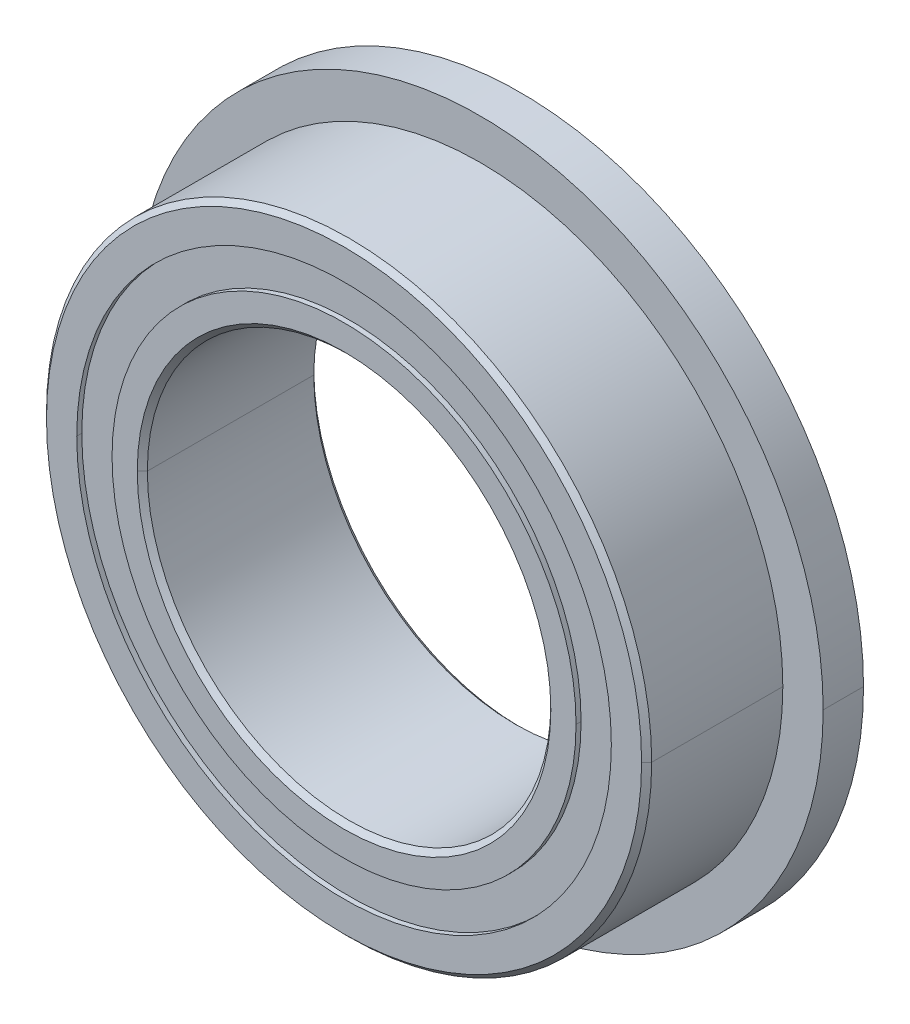
ISO-10303-21;
HEADER;
FILE_DESCRIPTION(('STEP AP214'),'2;1');
FILE_NAME('part.step','',(''),(''),'','','');
FILE_SCHEMA(('AUTOMOTIVE_DESIGN { 1 0 10303 214 1 1 1 1 }'));
ENDSEC;
DATA;
#1=APPLICATION_CONTEXT('core data for automotive mechanical design processes');
#2=APPLICATION_PROTOCOL_DEFINITION('international standard','automotive_design',2000,#1);
#3=PRODUCT_CONTEXT('',#1,'mechanical');
#4=PRODUCT('Part','Part','',(#3));
#5=PRODUCT_RELATED_PRODUCT_CATEGORY('part','',(#4));
#6=PRODUCT_DEFINITION_FORMATION('','',#4);
#7=PRODUCT_DEFINITION_CONTEXT('part definition',#1,'design');
#8=PRODUCT_DEFINITION('design','',#6,#7);
#9=PRODUCT_DEFINITION_SHAPE('','',#8);
#10=(LENGTH_UNIT() NAMED_UNIT(*) SI_UNIT(.MILLI.,.METRE.));
#11=(NAMED_UNIT(*) PLANE_ANGLE_UNIT() SI_UNIT($,.RADIAN.));
#12=(NAMED_UNIT(*) SI_UNIT($,.STERADIAN.) SOLID_ANGLE_UNIT());
#13=UNCERTAINTY_MEASURE_WITH_UNIT(LENGTH_MEASURE(1.E-05),#10,'distance_accuracy_value','');
#14=(GEOMETRIC_REPRESENTATION_CONTEXT(3) GLOBAL_UNCERTAINTY_ASSIGNED_CONTEXT((#13)) GLOBAL_UNIT_ASSIGNED_CONTEXT((#10,
#11,#12)) REPRESENTATION_CONTEXT('',''));
#15=CARTESIAN_POINT('',(0.,0.,0.));
#16=DIRECTION('',(0.,0.,1.));
#17=DIRECTION('',(1.,0.,0.));
#18=AXIS2_PLACEMENT_3D('',#15,#16,#17);
#19=CARTESIAN_POINT('',(0.,0.,1.65));
#20=DIRECTION('',(0.,0.,1.));
#21=DIRECTION('',(1.,0.,0.));
#22=AXIS2_PLACEMENT_3D('',#19,#20,#21);
#23=CONICAL_SURFACE('',#22,4.,0.785398163397435);
#24=DIRECTION('',(-0.707106781186538,0.,0.707106781186557));
#25=VECTOR('',#24,1.);
#26=CARTESIAN_POINT('',(-4.,0.,1.65));
#27=LINE('',#26,#25);
#28=CARTESIAN_POINT('',(-4.,0.,1.65));
#29=VERTEX_POINT('',#28);
#30=CARTESIAN_POINT('',(-4.1,0.,1.75));
#31=VERTEX_POINT('',#30);
#32=EDGE_CURVE('E358',#29,#31,#27,.T.);
#33=ORIENTED_EDGE('',*,*,#32,.F.);
#34=CARTESIAN_POINT('',(0.,0.,1.65));
#35=DIRECTION('',(0.,0.,1.));
#36=DIRECTION('',(-1.,0.,0.));
#37=AXIS2_PLACEMENT_3D('',#34,#35,#36);
#38=CIRCLE('',#37,4.);
#39=CARTESIAN_POINT('',(4.,0.,1.65));
#40=VERTEX_POINT('',#39);
#41=EDGE_CURVE('E308',#40,#29,#38,.T.);
#42=ORIENTED_EDGE('',*,*,#41,.F.);
#43=DIRECTION('',(0.707106781186538,0.,0.707106781186557));
#44=VECTOR('',#43,1.);
#45=CARTESIAN_POINT('',(4.,0.,1.65));
#46=LINE('',#45,#44);
#47=CARTESIAN_POINT('',(4.1,0.,1.75));
#48=VERTEX_POINT('',#47);
#49=EDGE_CURVE('E371',#40,#48,#46,.T.);
#50=ORIENTED_EDGE('',*,*,#49,.T.);
#51=CARTESIAN_POINT('',(0.,0.,1.75));
#52=DIRECTION('',(0.,0.,-1.));
#53=DIRECTION('',(-1.,0.,0.));
#54=AXIS2_PLACEMENT_3D('',#51,#52,#53);
#55=CIRCLE('',#54,4.1);
#56=EDGE_CURVE('E298',#31,#48,#55,.T.);
#57=ORIENTED_EDGE('',*,*,#56,.F.);
#58=EDGE_LOOP('',(#33,#42,#50,#57));
#59=FACE_BOUND('',#58,.T.);
#60=ADVANCED_FACE('F16',(#59),#23,.F.);
#61=CARTESIAN_POINT('',(0.,0.,-1.75));
#62=DIRECTION('',(0.,0.,-1.));
#63=DIRECTION('',(-1.,0.,0.));
#64=AXIS2_PLACEMENT_3D('',#61,#62,#63);
#65=CONICAL_SURFACE('',#64,4.1,0.785398163397448);
#66=DIRECTION('',(0.707106781186548,0.,-0.707106781186548));
#67=VECTOR('',#66,1.);
#68=CARTESIAN_POINT('',(4.1,0.,-1.75));
#69=LINE('',#68,#67);
#70=CARTESIAN_POINT('',(4.,0.,-1.65));
#71=VERTEX_POINT('',#70);
#72=CARTESIAN_POINT('',(4.1,0.,-1.75));
#73=VERTEX_POINT('',#72);
#74=EDGE_CURVE('E390',#71,#73,#69,.T.);
#75=ORIENTED_EDGE('',*,*,#74,.F.);
#76=CARTESIAN_POINT('',(0.,0.,-1.65));
#77=DIRECTION('',(0.,0.,-1.));
#78=DIRECTION('',(1.,0.,0.));
#79=AXIS2_PLACEMENT_3D('',#76,#77,#78);
#80=CIRCLE('',#79,4.);
#81=CARTESIAN_POINT('',(-4.,0.,-1.65));
#82=VERTEX_POINT('',#81);
#83=EDGE_CURVE('E305',#82,#71,#80,.T.);
#84=ORIENTED_EDGE('',*,*,#83,.F.);
#85=DIRECTION('',(-0.707106781186548,0.,-0.707106781186548));
#86=VECTOR('',#85,1.);
#87=CARTESIAN_POINT('',(-4.1,0.,-1.75));
#88=LINE('',#87,#86);
#89=CARTESIAN_POINT('',(-4.1,0.,-1.75));
#90=VERTEX_POINT('',#89);
#91=EDGE_CURVE('E404',#82,#90,#88,.T.);
#92=ORIENTED_EDGE('',*,*,#91,.T.);
#93=CARTESIAN_POINT('',(0.,0.,-1.75));
#94=DIRECTION('',(0.,0.,1.));
#95=DIRECTION('',(1.,0.,0.));
#96=AXIS2_PLACEMENT_3D('',#93,#94,#95);
#97=CIRCLE('',#96,4.1);
#98=EDGE_CURVE('E183',#73,#90,#97,.T.);
#99=ORIENTED_EDGE('',*,*,#98,.F.);
#100=EDGE_LOOP('',(#75,#84,#92,#99));
#101=FACE_BOUND('',#100,.T.);
#102=ADVANCED_FACE('F349',(#101),#65,.F.);
#103=CARTESIAN_POINT('',(0.,0.,1.75));
#104=DIRECTION('',(0.,0.,-1.));
#105=DIRECTION('',(-1.,0.,0.));
#106=AXIS2_PLACEMENT_3D('',#103,#104,#105);
#107=CONICAL_SURFACE('',#106,5.9,0.785398163397443);
#108=DIRECTION('',(0.707106781186545,0.,-0.707106781186551));
#109=VECTOR('',#108,1.);
#110=CARTESIAN_POINT('',(5.9,0.,1.75));
#111=LINE('',#110,#109);
#112=CARTESIAN_POINT('',(5.9,0.,1.75));
#113=VERTEX_POINT('',#112);
#114=CARTESIAN_POINT('',(6.,0.,1.65));
#115=VERTEX_POINT('',#114);
#116=EDGE_CURVE('E409',#113,#115,#111,.T.);
#117=ORIENTED_EDGE('',*,*,#116,.F.);
#118=CARTESIAN_POINT('',(0.,0.,1.75));
#119=DIRECTION('',(0.,0.,1.));
#120=DIRECTION('',(-1.,0.,0.));
#121=AXIS2_PLACEMENT_3D('',#118,#119,#120);
#122=CIRCLE('',#121,5.9);
#123=CARTESIAN_POINT('',(-5.9,0.,1.75));
#124=VERTEX_POINT('',#123);
#125=EDGE_CURVE('E301',#124,#113,#122,.T.);
#126=ORIENTED_EDGE('',*,*,#125,.F.);
#127=DIRECTION('',(-0.707106781186545,0.,-0.707106781186551));
#128=VECTOR('',#127,1.);
#129=CARTESIAN_POINT('',(-5.9,0.,1.75));
#130=LINE('',#129,#128);
#131=CARTESIAN_POINT('',(-6.,0.,1.65));
#132=VERTEX_POINT('',#131);
#133=EDGE_CURVE('E399',#124,#132,#130,.T.);
#134=ORIENTED_EDGE('',*,*,#133,.T.);
#135=CARTESIAN_POINT('',(0.,0.,1.65));
#136=DIRECTION('',(0.,0.,-1.));
#137=DIRECTION('',(-1.,0.,0.));
#138=AXIS2_PLACEMENT_3D('',#135,#136,#137);
#139=CIRCLE('',#138,6.);
#140=EDGE_CURVE('E285',#115,#132,#139,.T.);
#141=ORIENTED_EDGE('',*,*,#140,.F.);
#142=EDGE_LOOP('',(#117,#126,#134,#141));
#143=FACE_BOUND('',#142,.T.);
#144=ADVANCED_FACE('F354',(#143),#107,.T.);
#145=CARTESIAN_POINT('',(0.,0.,-1.65));
#146=DIRECTION('',(0.,0.,-1.));
#147=DIRECTION('',(-1.,0.,0.));
#148=AXIS2_PLACEMENT_3D('',#145,#146,#147);
#149=CYLINDRICAL_SURFACE('',#148,4.6);
#150=DIRECTION('',(0.,0.,-1.));
#151=VECTOR('',#150,1.);
#152=CARTESIAN_POINT('',(4.6,0.,-1.65));
#153=LINE('',#152,#151);
#154=CARTESIAN_POINT('',(4.6,0.,-1.65));
#155=VERTEX_POINT('',#154);
#156=CARTESIAN_POINT('',(4.6,0.,-1.75));
#157=VERTEX_POINT('',#156);
#158=EDGE_CURVE('E196',#155,#157,#153,.T.);
#159=ORIENTED_EDGE('',*,*,#158,.F.);
#160=CARTESIAN_POINT('',(0.,0.,-1.65));
#161=DIRECTION('',(0.,0.,1.));
#162=DIRECTION('',(1.,0.,0.));
#163=AXIS2_PLACEMENT_3D('',#160,#161,#162);
#164=CIRCLE('',#163,4.6);
#165=CARTESIAN_POINT('',(-4.6,0.,-1.65));
#166=VERTEX_POINT('',#165);
#167=EDGE_CURVE('E10',#166,#155,#164,.T.);
#168=ORIENTED_EDGE('',*,*,#167,.F.);
#169=DIRECTION('',(0.,0.,-1.));
#170=VECTOR('',#169,1.);
#171=CARTESIAN_POINT('',(-4.6,0.,-1.65));
#172=LINE('',#171,#170);
#173=CARTESIAN_POINT('',(-4.6,0.,-1.75));
#174=VERTEX_POINT('',#173);
#175=EDGE_CURVE('E187',#166,#174,#172,.T.);
#176=ORIENTED_EDGE('',*,*,#175,.T.);
#177=CARTESIAN_POINT('',(0.,0.,-1.75));
#178=DIRECTION('',(0.,0.,1.));
#179=DIRECTION('',(1.,0.,0.));
#180=AXIS2_PLACEMENT_3D('',#177,#178,#179);
#181=CIRCLE('',#180,4.6);
#182=EDGE_CURVE('E174',#174,#157,#181,.T.);
#183=ORIENTED_EDGE('',*,*,#182,.T.);
#184=EDGE_LOOP('',(#159,#168,#176,#183));
#185=FACE_BOUND('',#184,.T.);
#186=ADVANCED_FACE('F188',(#185),#149,.T.);
#187=CARTESIAN_POINT('',(0.,0.,-1.65));
#188=DIRECTION('',(0.,0.,-1.));
#189=DIRECTION('',(-1.,0.,0.));
#190=AXIS2_PLACEMENT_3D('',#187,#188,#189);
#191=CYLINDRICAL_SURFACE('',#190,5.3);
#192=DIRECTION('',(0.,0.,-1.));
#193=VECTOR('',#192,1.);
#194=CARTESIAN_POINT('',(5.3,0.,-1.65));
#195=LINE('',#194,#193);
#196=CARTESIAN_POINT('',(5.3,0.,-1.65));
#197=VERTEX_POINT('',#196);
#198=CARTESIAN_POINT('',(5.3,0.,-1.75));
#199=VERTEX_POINT('',#198);
#200=EDGE_CURVE('E211',#197,#199,#195,.T.);
#201=ORIENTED_EDGE('',*,*,#200,.F.);
#202=CARTESIAN_POINT('',(0.,0.,-1.65));
#203=DIRECTION('',(0.,0.,1.));
#204=DIRECTION('',(1.,0.,0.));
#205=AXIS2_PLACEMENT_3D('',#202,#203,#204);
#206=CIRCLE('',#205,5.3);
#207=CARTESIAN_POINT('',(-5.3,0.,-1.65));
#208=VERTEX_POINT('',#207);
#209=EDGE_CURVE('E24',#197,#208,#206,.T.);
#210=ORIENTED_EDGE('',*,*,#209,.T.);
#211=DIRECTION('',(0.,0.,-1.));
#212=VECTOR('',#211,1.);
#213=CARTESIAN_POINT('',(-5.3,0.,-1.65));
#214=LINE('',#213,#212);
#215=CARTESIAN_POINT('',(-5.3,0.,-1.75));
#216=VERTEX_POINT('',#215);
#217=EDGE_CURVE('E219',#208,#216,#214,.T.);
#218=ORIENTED_EDGE('',*,*,#217,.T.);
#219=CARTESIAN_POINT('',(0.,0.,-1.75));
#220=DIRECTION('',(0.,0.,1.));
#221=DIRECTION('',(1.,0.,0.));
#222=AXIS2_PLACEMENT_3D('',#219,#220,#221);
#223=CIRCLE('',#222,5.3);
#224=EDGE_CURVE('E314',#199,#216,#223,.T.);
#225=ORIENTED_EDGE('',*,*,#224,.F.);
#226=EDGE_LOOP('',(#201,#210,#218,#225));
#227=FACE_BOUND('',#226,.T.);
#228=ADVANCED_FACE('F328',(#227),#191,.F.);
#229=CARTESIAN_POINT('',(0.,0.,-1.65));
#230=DIRECTION('',(0.,0.,-1.));
#231=DIRECTION('',(0.,-1.,0.));
#232=AXIS2_PLACEMENT_3D('',#229,#230,#231);
#233=PLANE('',#232);
#234=ORIENTED_EDGE('',*,*,#167,.T.);
#235=CARTESIAN_POINT('',(0.,0.,-1.65));
#236=DIRECTION('',(0.,0.,1.));
#237=DIRECTION('',(1.,0.,0.));
#238=AXIS2_PLACEMENT_3D('',#235,#236,#237);
#239=CIRCLE('',#238,4.6);
#240=EDGE_CURVE('E203',#155,#166,#239,.T.);
#241=ORIENTED_EDGE('',*,*,#240,.T.);
#242=EDGE_LOOP('',(#234,#241));
#243=FACE_BOUND('',#242,.T.);
#244=CARTESIAN_POINT('',(0.,0.,-1.65));
#245=DIRECTION('',(0.,0.,1.));
#246=DIRECTION('',(1.,0.,0.));
#247=AXIS2_PLACEMENT_3D('',#244,#245,#246);
#248=CIRCLE('',#247,5.3);
#249=EDGE_CURVE('E193',#208,#197,#248,.T.);
#250=ORIENTED_EDGE('',*,*,#249,.F.);
#251=ORIENTED_EDGE('',*,*,#209,.F.);
#252=EDGE_LOOP('',(#250,#251));
#253=FACE_BOUND('',#252,.T.);
#254=ADVANCED_FACE('F334',(#243,#253),#233,.T.);
#255=CARTESIAN_POINT('',(0.,0.,1.65));
#256=DIRECTION('',(0.,0.,1.));
#257=DIRECTION('',(1.,0.,0.));
#258=AXIS2_PLACEMENT_3D('',#255,#256,#257);
#259=CYLINDRICAL_SURFACE('',#258,4.6);
#260=DIRECTION('',(0.,0.,1.));
#261=VECTOR('',#260,1.);
#262=CARTESIAN_POINT('',(-4.6,0.,1.65));
#263=LINE('',#262,#261);
#264=CARTESIAN_POINT('',(-4.6,0.,1.65));
#265=VERTEX_POINT('',#264);
#266=CARTESIAN_POINT('',(-4.6,0.,1.75));
#267=VERTEX_POINT('',#266);
#268=EDGE_CURVE('E227',#265,#267,#263,.T.);
#269=ORIENTED_EDGE('',*,*,#268,.F.);
#270=CARTESIAN_POINT('',(0.,0.,1.65));
#271=DIRECTION('',(0.,0.,1.));
#272=DIRECTION('',(1.,0.,0.));
#273=AXIS2_PLACEMENT_3D('',#270,#271,#272);
#274=CIRCLE('',#273,4.6);
#275=CARTESIAN_POINT('',(4.6,0.,1.65));
#276=VERTEX_POINT('',#275);
#277=EDGE_CURVE('E289',#265,#276,#274,.T.);
#278=ORIENTED_EDGE('',*,*,#277,.T.);
#279=DIRECTION('',(0.,0.,1.));
#280=VECTOR('',#279,1.);
#281=CARTESIAN_POINT('',(4.6,0.,1.65));
#282=LINE('',#281,#280);
#283=CARTESIAN_POINT('',(4.6,0.,1.75));
#284=VERTEX_POINT('',#283);
#285=EDGE_CURVE('E235',#276,#284,#282,.T.);
#286=ORIENTED_EDGE('',*,*,#285,.T.);
#287=CARTESIAN_POINT('',(0.,0.,1.75));
#288=DIRECTION('',(0.,0.,1.));
#289=DIRECTION('',(1.,0.,0.));
#290=AXIS2_PLACEMENT_3D('',#287,#288,#289);
#291=CIRCLE('',#290,4.6);
#292=EDGE_CURVE('E295',#267,#284,#291,.T.);
#293=ORIENTED_EDGE('',*,*,#292,.F.);
#294=EDGE_LOOP('',(#269,#278,#286,#293));
#295=FACE_BOUND('',#294,.T.);
#296=ADVANCED_FACE('F336',(#295),#259,.T.);
#297=CARTESIAN_POINT('',(0.,0.,1.65));
#298=DIRECTION('',(0.,0.,1.));
#299=DIRECTION('',(1.,0.,0.));
#300=AXIS2_PLACEMENT_3D('',#297,#298,#299);
#301=PLANE('',#300);
#302=CARTESIAN_POINT('',(0.,0.,1.65));
#303=DIRECTION('',(0.,0.,1.));
#304=DIRECTION('',(1.,0.,0.));
#305=AXIS2_PLACEMENT_3D('',#302,#303,#304);
#306=CIRCLE('',#305,4.6);
#307=EDGE_CURVE('E223',#276,#265,#306,.T.);
#308=ORIENTED_EDGE('',*,*,#307,.F.);
#309=ORIENTED_EDGE('',*,*,#277,.F.);
#310=EDGE_LOOP('',(#308,#309));
#311=FACE_BOUND('',#310,.T.);
#312=CARTESIAN_POINT('',(0.,0.,1.65));
#313=DIRECTION('',(0.,0.,1.));
#314=DIRECTION('',(1.,0.,0.));
#315=AXIS2_PLACEMENT_3D('',#312,#313,#314);
#316=CIRCLE('',#315,5.3);
#317=CARTESIAN_POINT('',(5.3,0.,1.65));
#318=VERTEX_POINT('',#317);
#319=CARTESIAN_POINT('',(-5.3,0.,1.65));
#320=VERTEX_POINT('',#319);
#321=EDGE_CURVE('E292',#318,#320,#316,.T.);
#322=ORIENTED_EDGE('',*,*,#321,.T.);
#323=CARTESIAN_POINT('',(0.,0.,1.65));
#324=DIRECTION('',(0.,0.,1.));
#325=DIRECTION('',(1.,0.,0.));
#326=AXIS2_PLACEMENT_3D('',#323,#324,#325);
#327=CIRCLE('',#326,5.3);
#328=EDGE_CURVE('E239',#320,#318,#327,.T.);
#329=ORIENTED_EDGE('',*,*,#328,.T.);
#330=EDGE_LOOP('',(#322,#329));
#331=FACE_BOUND('',#330,.T.);
#332=ADVANCED_FACE('F344',(#311,#331),#301,.T.);
#333=CARTESIAN_POINT('',(0.,0.,1.65));
#334=DIRECTION('',(0.,0.,1.));
#335=DIRECTION('',(1.,0.,0.));
#336=AXIS2_PLACEMENT_3D('',#333,#334,#335);
#337=CYLINDRICAL_SURFACE('',#336,5.3);
#338=DIRECTION('',(0.,0.,1.));
#339=VECTOR('',#338,1.);
#340=CARTESIAN_POINT('',(-5.3,0.,1.65));
#341=LINE('',#340,#339);
#342=CARTESIAN_POINT('',(-5.3,0.,1.75));
#343=VERTEX_POINT('',#342);
#344=EDGE_CURVE('E243',#320,#343,#341,.T.);
#345=ORIENTED_EDGE('',*,*,#344,.F.);
#346=ORIENTED_EDGE('',*,*,#321,.F.);
#347=DIRECTION('',(0.,0.,1.));
#348=VECTOR('',#347,1.);
#349=CARTESIAN_POINT('',(5.3,0.,1.65));
#350=LINE('',#349,#348);
#351=CARTESIAN_POINT('',(5.3,0.,1.75));
#352=VERTEX_POINT('',#351);
#353=EDGE_CURVE('E251',#318,#352,#350,.T.);
#354=ORIENTED_EDGE('',*,*,#353,.T.);
#355=CARTESIAN_POINT('',(0.,0.,1.75));
#356=DIRECTION('',(0.,0.,1.));
#357=DIRECTION('',(1.,0.,0.));
#358=AXIS2_PLACEMENT_3D('',#355,#356,#357);
#359=CIRCLE('',#358,5.3);
#360=EDGE_CURVE('E302',#352,#343,#359,.T.);
#361=ORIENTED_EDGE('',*,*,#360,.T.);
#362=EDGE_LOOP('',(#345,#346,#354,#361));
#363=FACE_BOUND('',#362,.T.);
#364=ADVANCED_FACE('F461',(#363),#337,.F.);
#365=CARTESIAN_POINT('',(0.,0.,1.75));
#366=DIRECTION('',(0.,0.,1.));
#367=DIRECTION('',(1.,0.,0.));
#368=AXIS2_PLACEMENT_3D('',#365,#366,#367);
#369=CYLINDRICAL_SURFACE('',#368,6.);
#370=DIRECTION('',(0.,0.,1.));
#371=VECTOR('',#370,1.);
#372=CARTESIAN_POINT('',(-6.,0.,1.75));
#373=LINE('',#372,#371);
#374=CARTESIAN_POINT('',(-6.,0.,-0.95));
#375=VERTEX_POINT('',#374);
#376=EDGE_CURVE('E256',#375,#132,#373,.T.);
#377=ORIENTED_EDGE('',*,*,#376,.F.);
#378=CARTESIAN_POINT('',(0.,0.,-0.95));
#379=DIRECTION('',(0.,0.,1.));
#380=DIRECTION('',(1.,0.,0.));
#381=AXIS2_PLACEMENT_3D('',#378,#379,#380);
#382=CIRCLE('',#381,6.);
#383=CARTESIAN_POINT('',(6.,0.,-0.95));
#384=VERTEX_POINT('',#383);
#385=EDGE_CURVE('E282',#375,#384,#382,.T.);
#386=ORIENTED_EDGE('',*,*,#385,.T.);
#387=DIRECTION('',(0.,0.,1.));
#388=VECTOR('',#387,1.);
#389=CARTESIAN_POINT('',(6.,0.,1.75));
#390=LINE('',#389,#388);
#391=EDGE_CURVE('E260',#384,#115,#390,.T.);
#392=ORIENTED_EDGE('',*,*,#391,.T.);
#393=ORIENTED_EDGE('',*,*,#140,.T.);
#394=EDGE_LOOP('',(#377,#386,#392,#393));
#395=FACE_BOUND('',#394,.T.);
#396=ADVANCED_FACE('F432',(#395),#369,.T.);
#397=CARTESIAN_POINT('',(0.,6.8,-0.95));
#398=DIRECTION('',(0.,0.,-1.));
#399=DIRECTION('',(0.,-1.,0.));
#400=AXIS2_PLACEMENT_3D('',#397,#398,#399);
#401=PLANE('',#400);
#402=CARTESIAN_POINT('',(0.,0.,-0.95));
#403=DIRECTION('',(0.,0.,1.));
#404=DIRECTION('',(1.,0.,0.));
#405=AXIS2_PLACEMENT_3D('',#402,#403,#404);
#406=CIRCLE('',#405,6.);
#407=EDGE_CURVE('E255',#384,#375,#406,.T.);
#408=ORIENTED_EDGE('',*,*,#407,.F.);
#409=ORIENTED_EDGE('',*,*,#385,.F.);
#410=EDGE_LOOP('',(#408,#409));
#411=FACE_BOUND('',#410,.T.);
#412=CARTESIAN_POINT('',(0.,0.,-0.95));
#413=DIRECTION('',(0.,0.,1.));
#414=DIRECTION('',(1.,0.,0.));
#415=AXIS2_PLACEMENT_3D('',#412,#413,#414);
#416=CIRCLE('',#415,6.8);
#417=CARTESIAN_POINT('',(6.8,0.,-0.95));
#418=VERTEX_POINT('',#417);
#419=CARTESIAN_POINT('',(-6.8,0.,-0.95));
#420=VERTEX_POINT('',#419);
#421=EDGE_CURVE('E272',#418,#420,#416,.T.);
#422=ORIENTED_EDGE('',*,*,#421,.T.);
#423=CARTESIAN_POINT('',(0.,0.,-0.95));
#424=DIRECTION('',(0.,0.,1.));
#425=DIRECTION('',(1.,0.,0.));
#426=AXIS2_PLACEMENT_3D('',#423,#424,#425);
#427=CIRCLE('',#426,6.8);
#428=EDGE_CURVE('E36',#420,#418,#427,.T.);
#429=ORIENTED_EDGE('',*,*,#428,.T.);
#430=EDGE_LOOP('',(#422,#429));
#431=FACE_BOUND('',#430,.T.);
#432=ADVANCED_FACE('F434',(#411,#431),#401,.F.);
#433=CARTESIAN_POINT('',(0.,0.,1.75));
#434=DIRECTION('',(0.,0.,1.));
#435=DIRECTION('',(1.,0.,0.));
#436=AXIS2_PLACEMENT_3D('',#433,#434,#435);
#437=CYLINDRICAL_SURFACE('',#436,6.8);
#438=DIRECTION('',(0.,0.,1.));
#439=VECTOR('',#438,1.);
#440=CARTESIAN_POINT('',(-6.8,0.,1.75));
#441=LINE('',#440,#439);
#442=CARTESIAN_POINT('',(-6.8,0.,-1.75));
#443=VERTEX_POINT('',#442);
#444=EDGE_CURVE('E268',#443,#420,#441,.T.);
#445=ORIENTED_EDGE('',*,*,#444,.F.);
#446=CARTESIAN_POINT('',(0.,0.,-1.75));
#447=DIRECTION('',(0.,0.,1.));
#448=DIRECTION('',(1.,0.,0.));
#449=AXIS2_PLACEMENT_3D('',#446,#447,#448);
#450=CIRCLE('',#449,6.8);
#451=CARTESIAN_POINT('',(6.8,0.,-1.75));
#452=VERTEX_POINT('',#451);
#453=EDGE_CURVE('E311',#443,#452,#450,.T.);
#454=ORIENTED_EDGE('',*,*,#453,.T.);
#455=DIRECTION('',(0.,0.,1.));
#456=VECTOR('',#455,1.);
#457=CARTESIAN_POINT('',(6.8,0.,1.75));
#458=LINE('',#457,#456);
#459=EDGE_CURVE('E275',#452,#418,#458,.T.);
#460=ORIENTED_EDGE('',*,*,#459,.T.);
#461=ORIENTED_EDGE('',*,*,#428,.F.);
#462=EDGE_LOOP('',(#445,#454,#460,#461));
#463=FACE_BOUND('',#462,.T.);
#464=ADVANCED_FACE('F436',(#463),#437,.T.);
#465=CARTESIAN_POINT('',(0.,4.,-1.75));
#466=DIRECTION('',(0.,0.,1.));
#467=DIRECTION('',(1.,0.,0.));
#468=AXIS2_PLACEMENT_3D('',#465,#466,#467);
#469=PLANE('',#468);
#470=CARTESIAN_POINT('',(0.,0.,-1.75));
#471=DIRECTION('',(0.,0.,1.));
#472=DIRECTION('',(1.,0.,0.));
#473=AXIS2_PLACEMENT_3D('',#470,#471,#472);
#474=CIRCLE('',#473,5.3);
#475=EDGE_CURVE('E215',#216,#199,#474,.T.);
#476=ORIENTED_EDGE('',*,*,#475,.T.);
#477=ORIENTED_EDGE('',*,*,#224,.T.);
#478=EDGE_LOOP('',(#476,#477));
#479=FACE_BOUND('',#478,.T.);
#480=CARTESIAN_POINT('',(0.,0.,-1.75));
#481=DIRECTION('',(0.,0.,1.));
#482=DIRECTION('',(1.,0.,0.));
#483=AXIS2_PLACEMENT_3D('',#480,#481,#482);
#484=CIRCLE('',#483,6.8);
#485=EDGE_CURVE('E264',#452,#443,#484,.T.);
#486=ORIENTED_EDGE('',*,*,#485,.F.);
#487=ORIENTED_EDGE('',*,*,#453,.F.);
#488=EDGE_LOOP('',(#486,#487));
#489=FACE_BOUND('',#488,.T.);
#490=ADVANCED_FACE('F444',(#479,#489),#469,.F.);
#491=CARTESIAN_POINT('',(0.,0.,1.75));
#492=DIRECTION('',(0.,0.,1.));
#493=DIRECTION('',(1.,0.,0.));
#494=AXIS2_PLACEMENT_3D('',#491,#492,#493);
#495=CYLINDRICAL_SURFACE('',#494,4.);
#496=DIRECTION('',(0.,0.,1.));
#497=VECTOR('',#496,1.);
#498=CARTESIAN_POINT('',(-4.,0.,1.75));
#499=LINE('',#498,#497);
#500=EDGE_CURVE('E278',#82,#29,#499,.T.);
#501=ORIENTED_EDGE('',*,*,#500,.F.);
#502=ORIENTED_EDGE('',*,*,#83,.T.);
#503=DIRECTION('',(0.,0.,1.));
#504=VECTOR('',#503,1.);
#505=CARTESIAN_POINT('',(4.,0.,1.75));
#506=LINE('',#505,#504);
#507=EDGE_CURVE('E184',#71,#40,#506,.T.);
#508=ORIENTED_EDGE('',*,*,#507,.T.);
#509=ORIENTED_EDGE('',*,*,#41,.T.);
#510=EDGE_LOOP('',(#501,#502,#508,#509));
#511=FACE_BOUND('',#510,.T.);
#512=ADVANCED_FACE('F446',(#511),#495,.F.);
#513=CARTESIAN_POINT('',(0.,6.,1.75));
#514=DIRECTION('',(0.,0.,-1.));
#515=DIRECTION('',(0.,-1.,0.));
#516=AXIS2_PLACEMENT_3D('',#513,#514,#515);
#517=PLANE('',#516);
#518=ORIENTED_EDGE('',*,*,#360,.F.);
#519=CARTESIAN_POINT('',(0.,0.,1.75));
#520=DIRECTION('',(0.,0.,1.));
#521=DIRECTION('',(1.,0.,0.));
#522=AXIS2_PLACEMENT_3D('',#519,#520,#521);
#523=CIRCLE('',#522,5.3);
#524=EDGE_CURVE('E247',#343,#352,#523,.T.);
#525=ORIENTED_EDGE('',*,*,#524,.F.);
#526=EDGE_LOOP('',(#518,#525));
#527=FACE_BOUND('',#526,.T.);
#528=ORIENTED_EDGE('',*,*,#125,.T.);
#529=CARTESIAN_POINT('',(0.,0.,1.75));
#530=DIRECTION('',(0.,0.,1.));
#531=DIRECTION('',(-1.,0.,0.));
#532=AXIS2_PLACEMENT_3D('',#529,#530,#531);
#533=CIRCLE('',#532,5.9);
#534=EDGE_CURVE('E408',#113,#124,#533,.T.);
#535=ORIENTED_EDGE('',*,*,#534,.T.);
#536=EDGE_LOOP('',(#528,#535));
#537=FACE_BOUND('',#536,.T.);
#538=ADVANCED_FACE('F453',(#527,#537),#517,.F.);
#539=CARTESIAN_POINT('',(0.,6.,1.75));
#540=DIRECTION('',(0.,0.,-1.));
#541=DIRECTION('',(0.,-1.,0.));
#542=AXIS2_PLACEMENT_3D('',#539,#540,#541);
#543=PLANE('',#542);
#544=CARTESIAN_POINT('',(0.,0.,1.75));
#545=DIRECTION('',(0.,0.,-1.));
#546=DIRECTION('',(-1.,0.,0.));
#547=AXIS2_PLACEMENT_3D('',#544,#545,#546);
#548=CIRCLE('',#547,4.1);
#549=EDGE_CURVE('E365',#48,#31,#548,.T.);
#550=ORIENTED_EDGE('',*,*,#549,.T.);
#551=ORIENTED_EDGE('',*,*,#56,.T.);
#552=EDGE_LOOP('',(#550,#551));
#553=FACE_BOUND('',#552,.T.);
#554=CARTESIAN_POINT('',(0.,0.,1.75));
#555=DIRECTION('',(0.,0.,1.));
#556=DIRECTION('',(1.,0.,0.));
#557=AXIS2_PLACEMENT_3D('',#554,#555,#556);
#558=CIRCLE('',#557,4.6);
#559=EDGE_CURVE('E231',#284,#267,#558,.T.);
#560=ORIENTED_EDGE('',*,*,#559,.T.);
#561=ORIENTED_EDGE('',*,*,#292,.T.);
#562=EDGE_LOOP('',(#560,#561));
#563=FACE_BOUND('',#562,.T.);
#564=ADVANCED_FACE('F480',(#553,#563),#543,.F.);
#565=CARTESIAN_POINT('',(0.,4.,-1.75));
#566=DIRECTION('',(0.,0.,1.));
#567=DIRECTION('',(1.,0.,0.));
#568=AXIS2_PLACEMENT_3D('',#565,#566,#567);
#569=PLANE('',#568);
#570=CARTESIAN_POINT('',(0.,0.,-1.75));
#571=DIRECTION('',(0.,0.,1.));
#572=DIRECTION('',(1.,0.,0.));
#573=AXIS2_PLACEMENT_3D('',#570,#571,#572);
#574=CIRCLE('',#573,4.1);
#575=EDGE_CURVE('E380',#90,#73,#574,.T.);
#576=ORIENTED_EDGE('',*,*,#575,.T.);
#577=ORIENTED_EDGE('',*,*,#98,.T.);
#578=EDGE_LOOP('',(#576,#577));
#579=FACE_BOUND('',#578,.T.);
#580=ORIENTED_EDGE('',*,*,#182,.F.);
#581=CARTESIAN_POINT('',(0.,0.,-1.75));
#582=DIRECTION('',(0.,0.,1.));
#583=DIRECTION('',(1.,0.,0.));
#584=AXIS2_PLACEMENT_3D('',#581,#582,#583);
#585=CIRCLE('',#584,4.6);
#586=EDGE_CURVE('E178',#157,#174,#585,.T.);
#587=ORIENTED_EDGE('',*,*,#586,.F.);
#588=EDGE_LOOP('',(#580,#587));
#589=FACE_BOUND('',#588,.T.);
#590=ADVANCED_FACE('F176',(#579,#589),#569,.F.);
#591=CARTESIAN_POINT('',(0.,0.,1.75));
#592=DIRECTION('',(0.,0.,1.));
#593=DIRECTION('',(1.,0.,0.));
#594=AXIS2_PLACEMENT_3D('',#591,#592,#593);
#595=CYLINDRICAL_SURFACE('',#594,4.);
#596=CARTESIAN_POINT('',(0.,0.,-1.65));
#597=DIRECTION('',(0.,0.,-1.));
#598=DIRECTION('',(1.,0.,0.));
#599=AXIS2_PLACEMENT_3D('',#596,#597,#598);
#600=CIRCLE('',#599,4.);
#601=EDGE_CURVE('E386',#71,#82,#600,.T.);
#602=ORIENTED_EDGE('',*,*,#601,.T.);
#603=ORIENTED_EDGE('',*,*,#500,.T.);
#604=CARTESIAN_POINT('',(0.,0.,1.65));
#605=DIRECTION('',(0.,0.,1.));
#606=DIRECTION('',(-1.,0.,0.));
#607=AXIS2_PLACEMENT_3D('',#604,#605,#606);
#608=CIRCLE('',#607,4.);
#609=EDGE_CURVE('E366',#29,#40,#608,.T.);
#610=ORIENTED_EDGE('',*,*,#609,.T.);
#611=ORIENTED_EDGE('',*,*,#507,.F.);
#612=EDGE_LOOP('',(#602,#603,#610,#611));
#613=FACE_BOUND('',#612,.T.);
#614=ADVANCED_FACE('F491',(#613),#595,.F.);
#615=CARTESIAN_POINT('',(0.,0.,1.75));
#616=DIRECTION('',(0.,0.,1.));
#617=DIRECTION('',(1.,0.,0.));
#618=AXIS2_PLACEMENT_3D('',#615,#616,#617);
#619=CYLINDRICAL_SURFACE('',#618,6.8);
#620=ORIENTED_EDGE('',*,*,#485,.T.);
#621=ORIENTED_EDGE('',*,*,#444,.T.);
#622=ORIENTED_EDGE('',*,*,#421,.F.);
#623=ORIENTED_EDGE('',*,*,#459,.F.);
#624=EDGE_LOOP('',(#620,#621,#622,#623));
#625=FACE_BOUND('',#624,.T.);
#626=ADVANCED_FACE('F441',(#625),#619,.T.);
#627=CARTESIAN_POINT('',(0.,0.,1.75));
#628=DIRECTION('',(0.,0.,1.));
#629=DIRECTION('',(1.,0.,0.));
#630=AXIS2_PLACEMENT_3D('',#627,#628,#629);
#631=CYLINDRICAL_SURFACE('',#630,6.);
#632=ORIENTED_EDGE('',*,*,#407,.T.);
#633=ORIENTED_EDGE('',*,*,#376,.T.);
#634=CARTESIAN_POINT('',(0.,0.,1.65));
#635=DIRECTION('',(0.,0.,-1.));
#636=DIRECTION('',(-1.,0.,0.));
#637=AXIS2_PLACEMENT_3D('',#634,#635,#636);
#638=CIRCLE('',#637,6.);
#639=EDGE_CURVE('E403',#132,#115,#638,.T.);
#640=ORIENTED_EDGE('',*,*,#639,.T.);
#641=ORIENTED_EDGE('',*,*,#391,.F.);
#642=EDGE_LOOP('',(#632,#633,#640,#641));
#643=FACE_BOUND('',#642,.T.);
#644=ADVANCED_FACE('F422',(#643),#631,.T.);
#645=CARTESIAN_POINT('',(0.,0.,1.65));
#646=DIRECTION('',(0.,0.,1.));
#647=DIRECTION('',(1.,0.,0.));
#648=AXIS2_PLACEMENT_3D('',#645,#646,#647);
#649=CYLINDRICAL_SURFACE('',#648,5.3);
#650=ORIENTED_EDGE('',*,*,#328,.F.);
#651=ORIENTED_EDGE('',*,*,#344,.T.);
#652=ORIENTED_EDGE('',*,*,#524,.T.);
#653=ORIENTED_EDGE('',*,*,#353,.F.);
#654=EDGE_LOOP('',(#650,#651,#652,#653));
#655=FACE_BOUND('',#654,.T.);
#656=ADVANCED_FACE('F476',(#655),#649,.F.);
#657=CARTESIAN_POINT('',(0.,0.,1.65));
#658=DIRECTION('',(0.,0.,1.));
#659=DIRECTION('',(1.,0.,0.));
#660=AXIS2_PLACEMENT_3D('',#657,#658,#659);
#661=CYLINDRICAL_SURFACE('',#660,4.6);
#662=ORIENTED_EDGE('',*,*,#307,.T.);
#663=ORIENTED_EDGE('',*,*,#268,.T.);
#664=ORIENTED_EDGE('',*,*,#559,.F.);
#665=ORIENTED_EDGE('',*,*,#285,.F.);
#666=EDGE_LOOP('',(#662,#663,#664,#665));
#667=FACE_BOUND('',#666,.T.);
#668=ADVANCED_FACE('F705',(#667),#661,.T.);
#669=CARTESIAN_POINT('',(0.,0.,-1.65));
#670=DIRECTION('',(0.,0.,-1.));
#671=DIRECTION('',(-1.,0.,0.));
#672=AXIS2_PLACEMENT_3D('',#669,#670,#671);
#673=CYLINDRICAL_SURFACE('',#672,5.3);
#674=ORIENTED_EDGE('',*,*,#249,.T.);
#675=ORIENTED_EDGE('',*,*,#200,.T.);
#676=ORIENTED_EDGE('',*,*,#475,.F.);
#677=ORIENTED_EDGE('',*,*,#217,.F.);
#678=EDGE_LOOP('',(#674,#675,#676,#677));
#679=FACE_BOUND('',#678,.T.);
#680=ADVANCED_FACE('F333',(#679),#673,.F.);
#681=CARTESIAN_POINT('',(0.,0.,-1.65));
#682=DIRECTION('',(0.,0.,-1.));
#683=DIRECTION('',(-1.,0.,0.));
#684=AXIS2_PLACEMENT_3D('',#681,#682,#683);
#685=CYLINDRICAL_SURFACE('',#684,4.6);
#686=ORIENTED_EDGE('',*,*,#240,.F.);
#687=ORIENTED_EDGE('',*,*,#158,.T.);
#688=ORIENTED_EDGE('',*,*,#586,.T.);
#689=ORIENTED_EDGE('',*,*,#175,.F.);
#690=EDGE_LOOP('',(#686,#687,#688,#689));
#691=FACE_BOUND('',#690,.T.);
#692=ADVANCED_FACE('F195',(#691),#685,.T.);
#693=CARTESIAN_POINT('',(0.,0.,1.75));
#694=DIRECTION('',(0.,0.,-1.));
#695=DIRECTION('',(-1.,0.,0.));
#696=AXIS2_PLACEMENT_3D('',#693,#694,#695);
#697=CONICAL_SURFACE('',#696,5.9,0.785398163397443);
#698=ORIENTED_EDGE('',*,*,#534,.F.);
#699=ORIENTED_EDGE('',*,*,#116,.T.);
#700=ORIENTED_EDGE('',*,*,#639,.F.);
#701=ORIENTED_EDGE('',*,*,#133,.F.);
#702=EDGE_LOOP('',(#698,#699,#700,#701));
#703=FACE_BOUND('',#702,.T.);
#704=ADVANCED_FACE('F429',(#703),#697,.T.);
#705=CARTESIAN_POINT('',(0.,0.,-1.75));
#706=DIRECTION('',(0.,0.,-1.));
#707=DIRECTION('',(-1.,0.,0.));
#708=AXIS2_PLACEMENT_3D('',#705,#706,#707);
#709=CONICAL_SURFACE('',#708,4.1,0.785398163397448);
#710=ORIENTED_EDGE('',*,*,#601,.F.);
#711=ORIENTED_EDGE('',*,*,#74,.T.);
#712=ORIENTED_EDGE('',*,*,#575,.F.);
#713=ORIENTED_EDGE('',*,*,#91,.F.);
#714=EDGE_LOOP('',(#710,#711,#712,#713));
#715=FACE_BOUND('',#714,.T.);
#716=ADVANCED_FACE('F503',(#715),#709,.F.);
#717=CARTESIAN_POINT('',(0.,0.,1.65));
#718=DIRECTION('',(0.,0.,1.));
#719=DIRECTION('',(1.,0.,0.));
#720=AXIS2_PLACEMENT_3D('',#717,#718,#719);
#721=CONICAL_SURFACE('',#720,4.,0.785398163397435);
#722=ORIENTED_EDGE('',*,*,#609,.F.);
#723=ORIENTED_EDGE('',*,*,#32,.T.);
#724=ORIENTED_EDGE('',*,*,#549,.F.);
#725=ORIENTED_EDGE('',*,*,#49,.F.);
#726=EDGE_LOOP('',(#722,#723,#724,#725));
#727=FACE_BOUND('',#726,.T.);
#728=ADVANCED_FACE('F370',(#727),#721,.F.);
#729=CLOSED_SHELL('',(#60,#102,#144,#186,#228,#254,#296,#332,#364,#396,#432,#464,#490,#512,#538,
#564,#590,#614,#626,#644,#656,#668,#680,#692,#704,#716,#728));
#730=MANIFOLD_SOLID_BREP('B1',#729);
#731=ADVANCED_BREP_SHAPE_REPRESENTATION('',(#18,#730),#14);
#732=SHAPE_DEFINITION_REPRESENTATION(#9,#731);
ENDSEC;
END-ISO-10303-21;
